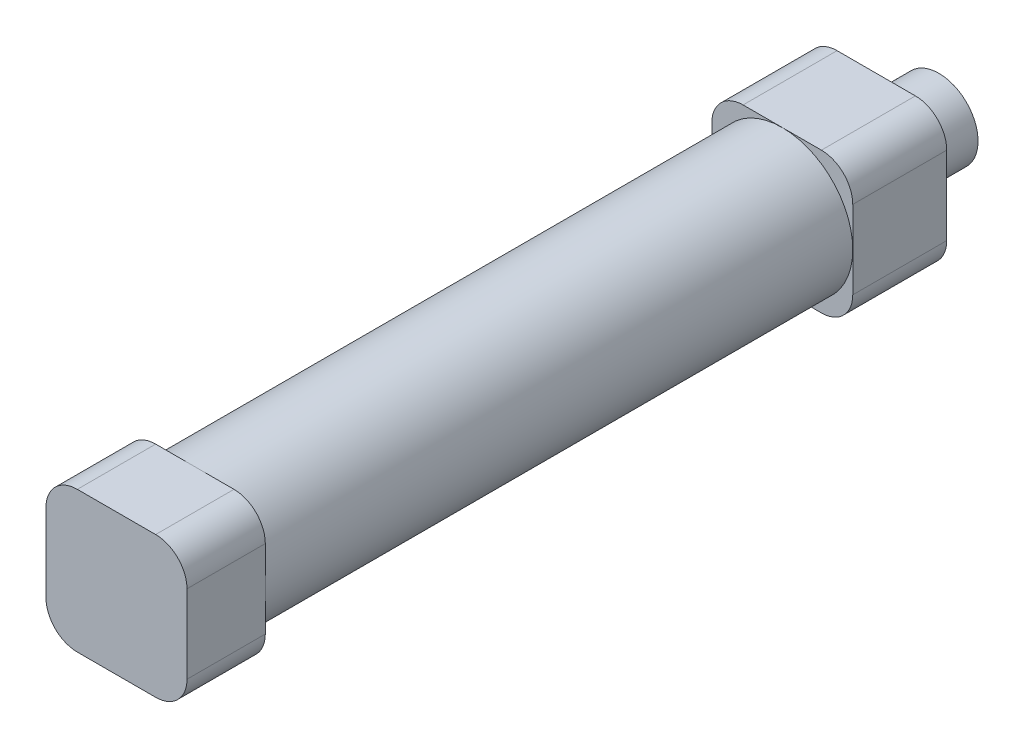
ISO-10303-21;
HEADER;
FILE_DESCRIPTION(('STEP AP214'),'2;1');
FILE_NAME('part.step','',(''),(''),'','','');
FILE_SCHEMA(('AUTOMOTIVE_DESIGN { 1 0 10303 214 1 1 1 1 }'));
ENDSEC;
DATA;
#1=APPLICATION_CONTEXT('core data for automotive mechanical design processes');
#2=APPLICATION_PROTOCOL_DEFINITION('international standard','automotive_design',2000,#1);
#3=PRODUCT_CONTEXT('',#1,'mechanical');
#4=PRODUCT('Part','Part','',(#3));
#5=PRODUCT_RELATED_PRODUCT_CATEGORY('part','',(#4));
#6=PRODUCT_DEFINITION_FORMATION('','',#4);
#7=PRODUCT_DEFINITION_CONTEXT('part definition',#1,'design');
#8=PRODUCT_DEFINITION('design','',#6,#7);
#9=PRODUCT_DEFINITION_SHAPE('','',#8);
#10=(LENGTH_UNIT() NAMED_UNIT(*) SI_UNIT(.MILLI.,.METRE.));
#11=(NAMED_UNIT(*) PLANE_ANGLE_UNIT() SI_UNIT($,.RADIAN.));
#12=(NAMED_UNIT(*) SI_UNIT($,.STERADIAN.) SOLID_ANGLE_UNIT());
#13=UNCERTAINTY_MEASURE_WITH_UNIT(LENGTH_MEASURE(1.E-05),#10,'distance_accuracy_value','');
#14=(GEOMETRIC_REPRESENTATION_CONTEXT(3) GLOBAL_UNCERTAINTY_ASSIGNED_CONTEXT((#13)) GLOBAL_UNIT_ASSIGNED_CONTEXT((#10,
#11,#12)) REPRESENTATION_CONTEXT('',''));
#15=CARTESIAN_POINT('',(0.,0.,0.));
#16=DIRECTION('',(0.,0.,1.));
#17=DIRECTION('',(1.,0.,0.));
#18=AXIS2_PLACEMENT_3D('',#15,#16,#17);
#19=CARTESIAN_POINT('',(4.99999999999999,-5.,0.));
#20=DIRECTION('',(0.,0.,-1.));
#21=DIRECTION('',(-1.,0.,0.));
#22=AXIS2_PLACEMENT_3D('',#19,#20,#21);
#23=PLANE('',#22);
#24=CARTESIAN_POINT('',(0.,0.,0.));
#25=DIRECTION('',(0.,0.,-1.));
#26=DIRECTION('',(-1.,0.,0.));
#27=AXIS2_PLACEMENT_3D('',#24,#25,#26);
#28=CIRCLE('',#27,2.5);
#29=CARTESIAN_POINT('',(-2.5,0.,0.));
#30=VERTEX_POINT('',#29);
#31=EDGE_CURVE('E40',#30,#30,#28,.T.);
#32=ORIENTED_EDGE('',*,*,#31,.T.);
#33=EDGE_LOOP('',(#32));
#34=FACE_BOUND('',#33,.T.);
#35=CARTESIAN_POINT('',(0.,0.,0.));
#36=DIRECTION('',(0.,0.,1.));
#37=DIRECTION('',(1.,0.,0.));
#38=AXIS2_PLACEMENT_3D('',#35,#36,#37);
#39=CIRCLE('',#38,8.);
#40=CARTESIAN_POINT('',(8.,0.,0.));
#41=VERTEX_POINT('',#40);
#42=EDGE_CURVE('E276',#41,#41,#39,.T.);
#43=ORIENTED_EDGE('',*,*,#42,.T.);
#44=EDGE_LOOP('',(#43));
#45=FACE_BOUND('',#44,.T.);
#46=ADVANCED_FACE('F36',(#34,#45),#23,.F.);
#47=CARTESIAN_POINT('',(-5.,5.,75.));
#48=DIRECTION('',(0.,0.,1.));
#49=DIRECTION('',(1.,0.,0.));
#50=AXIS2_PLACEMENT_3D('',#47,#48,#49);
#51=PLANE('',#50);
#52=CARTESIAN_POINT('',(0.,0.,75.));
#53=DIRECTION('',(0.,0.,1.));
#54=DIRECTION('',(1.,0.,0.));
#55=AXIS2_PLACEMENT_3D('',#52,#53,#54);
#56=CIRCLE('',#55,8.);
#57=CARTESIAN_POINT('',(8.,0.,75.));
#58=VERTEX_POINT('',#57);
#59=EDGE_CURVE('E273',#58,#58,#56,.T.);
#60=ORIENTED_EDGE('',*,*,#59,.F.);
#61=EDGE_LOOP('',(#60));
#62=FACE_BOUND('',#61,.T.);
#63=ADVANCED_FACE('F366',(#62),#51,.F.);
#64=CARTESIAN_POINT('',(0.,0.,75.));
#65=DIRECTION('',(0.,0.,-1.));
#66=DIRECTION('',(-1.,0.,0.));
#67=AXIS2_PLACEMENT_3D('',#64,#65,#66);
#68=CYLINDRICAL_SURFACE('',#67,8.);
#69=ORIENTED_EDGE('',*,*,#59,.T.);
#70=EDGE_LOOP('',(#69));
#71=FACE_BOUND('',#70,.T.);
#72=ORIENTED_EDGE('',*,*,#42,.F.);
#73=EDGE_LOOP('',(#72));
#74=FACE_BOUND('',#73,.T.);
#75=ADVANCED_FACE('F373',(#71,#74),#68,.F.);
#76=CARTESIAN_POINT('',(0.,0.,18.));
#77=DIRECTION('',(0.,0.,-1.));
#78=DIRECTION('',(-1.,0.,0.));
#79=AXIS2_PLACEMENT_3D('',#76,#77,#78);
#80=CYLINDRICAL_SURFACE('',#79,2.5);
#81=CARTESIAN_POINT('',(0.,0.,-20.));
#82=DIRECTION('',(0.,0.,-1.));
#83=DIRECTION('',(-1.,0.,0.));
#84=AXIS2_PLACEMENT_3D('',#81,#82,#83);
#85=CIRCLE('',#84,2.5);
#86=CARTESIAN_POINT('',(-2.5,0.,-20.));
#87=VERTEX_POINT('',#86);
#88=EDGE_CURVE('E564',#87,#87,#85,.T.);
#89=ORIENTED_EDGE('',*,*,#88,.T.);
#90=EDGE_LOOP('',(#89));
#91=FACE_BOUND('',#90,.T.);
#92=ORIENTED_EDGE('',*,*,#31,.F.);
#93=EDGE_LOOP('',(#92));
#94=FACE_BOUND('',#93,.T.);
#95=ADVANCED_FACE('F455',(#91,#94),#80,.F.);
#96=CARTESIAN_POINT('',(4.99999999999999,-5.,-12.));
#97=DIRECTION('',(0.,0.,-1.));
#98=DIRECTION('',(-1.,0.,0.));
#99=AXIS2_PLACEMENT_3D('',#96,#97,#98);
#100=PLANE('',#99);
#101=CARTESIAN_POINT('',(4.99999999999999,-5.,-12.));
#102=DIRECTION('',(0.,0.,-1.));
#103=DIRECTION('',(-1.,0.,0.));
#104=AXIS2_PLACEMENT_3D('',#101,#102,#103);
#105=CIRCLE('',#104,4.);
#106=CARTESIAN_POINT('',(8.99999999999999,-5.,-12.));
#107=VERTEX_POINT('',#106);
#108=CARTESIAN_POINT('',(4.99999999999999,-9.,-12.));
#109=VERTEX_POINT('',#108);
#110=EDGE_CURVE('E188',#107,#109,#105,.T.);
#111=ORIENTED_EDGE('',*,*,#110,.T.);
#112=DIRECTION('',(-1.,0.,0.));
#113=VECTOR('',#112,1.);
#114=CARTESIAN_POINT('',(4.99999999999999,-9.,-12.));
#115=LINE('',#114,#113);
#116=CARTESIAN_POINT('',(-5.00000000000001,-9.,-12.));
#117=VERTEX_POINT('',#116);
#118=EDGE_CURVE('E176',#109,#117,#115,.T.);
#119=ORIENTED_EDGE('',*,*,#118,.T.);
#120=CARTESIAN_POINT('',(-5.00000000000001,-5.,-12.));
#121=DIRECTION('',(0.,0.,-1.));
#122=DIRECTION('',(-1.,0.,0.));
#123=AXIS2_PLACEMENT_3D('',#120,#121,#122);
#124=CIRCLE('',#123,4.);
#125=CARTESIAN_POINT('',(-9.00000000000001,-5.,-12.));
#126=VERTEX_POINT('',#125);
#127=EDGE_CURVE('E187',#117,#126,#124,.T.);
#128=ORIENTED_EDGE('',*,*,#127,.T.);
#129=DIRECTION('',(0.,1.,0.));
#130=VECTOR('',#129,1.);
#131=CARTESIAN_POINT('',(-9.00000000000001,-5.,-12.));
#132=LINE('',#131,#130);
#133=CARTESIAN_POINT('',(-9.00000000000001,5.,-12.));
#134=VERTEX_POINT('',#133);
#135=EDGE_CURVE('E342',#126,#134,#132,.T.);
#136=ORIENTED_EDGE('',*,*,#135,.T.);
#137=CARTESIAN_POINT('',(-5.00000000000001,5.,-12.));
#138=DIRECTION('',(0.,0.,-1.));
#139=DIRECTION('',(-1.,0.,0.));
#140=AXIS2_PLACEMENT_3D('',#137,#138,#139);
#141=CIRCLE('',#140,4.);
#142=CARTESIAN_POINT('',(-5.00000000000001,9.,-12.));
#143=VERTEX_POINT('',#142);
#144=EDGE_CURVE('E341',#134,#143,#141,.T.);
#145=ORIENTED_EDGE('',*,*,#144,.T.);
#146=DIRECTION('',(1.,0.,0.));
#147=VECTOR('',#146,1.);
#148=CARTESIAN_POINT('',(4.99999999999999,9.,-12.));
#149=LINE('',#148,#147);
#150=CARTESIAN_POINT('',(4.99999999999999,9.,-12.));
#151=VERTEX_POINT('',#150);
#152=EDGE_CURVE('E344',#143,#151,#149,.T.);
#153=ORIENTED_EDGE('',*,*,#152,.T.);
#154=CARTESIAN_POINT('',(4.99999999999999,5.,-12.));
#155=DIRECTION('',(0.,0.,-1.));
#156=DIRECTION('',(-1.,0.,0.));
#157=AXIS2_PLACEMENT_3D('',#154,#155,#156);
#158=CIRCLE('',#157,4.);
#159=CARTESIAN_POINT('',(8.99999999999999,5.,-12.));
#160=VERTEX_POINT('',#159);
#161=EDGE_CURVE('E349',#151,#160,#158,.T.);
#162=ORIENTED_EDGE('',*,*,#161,.T.);
#163=DIRECTION('',(0.,-1.,0.));
#164=VECTOR('',#163,1.);
#165=CARTESIAN_POINT('',(8.99999999999999,-5.,-12.));
#166=LINE('',#165,#164);
#167=EDGE_CURVE('E194',#160,#107,#166,.T.);
#168=ORIENTED_EDGE('',*,*,#167,.T.);
#169=EDGE_LOOP('',(#111,#119,#128,#136,#145,#153,#162,#168));
#170=FACE_BOUND('',#169,.T.);
#171=CARTESIAN_POINT('',(0.,0.,-12.));
#172=DIRECTION('',(0.,0.,-1.));
#173=DIRECTION('',(-1.,0.,0.));
#174=AXIS2_PLACEMENT_3D('',#171,#172,#173);
#175=CIRCLE('',#174,5.);
#176=CARTESIAN_POINT('',(-5.,0.,-12.));
#177=VERTEX_POINT('',#176);
#178=EDGE_CURVE('E570',#177,#177,#175,.T.);
#179=ORIENTED_EDGE('',*,*,#178,.F.);
#180=EDGE_LOOP('',(#179));
#181=FACE_BOUND('',#180,.T.);
#182=ADVANCED_FACE('F191',(#170,#181),#100,.T.);
#183=CARTESIAN_POINT('',(0.,0.,75.));
#184=DIRECTION('',(0.,0.,-1.));
#185=DIRECTION('',(-1.,0.,0.));
#186=AXIS2_PLACEMENT_3D('',#183,#184,#185);
#187=CYLINDRICAL_SURFACE('',#186,9.);
#188=CARTESIAN_POINT('',(0.,0.,75.));
#189=DIRECTION('',(0.,0.,1.));
#190=DIRECTION('',(1.,0.,0.));
#191=AXIS2_PLACEMENT_3D('',#188,#189,#190);
#192=CIRCLE('',#191,9.);
#193=CARTESIAN_POINT('',(9.,0.,75.));
#194=VERTEX_POINT('',#193);
#195=CARTESIAN_POINT('',(0.,9.,75.));
#196=VERTEX_POINT('',#195);
#197=EDGE_CURVE('E12',#194,#196,#192,.T.);
#198=ORIENTED_EDGE('',*,*,#197,.F.);
#199=CARTESIAN_POINT('',(0.,-9.,75.));
#200=VERTEX_POINT('',#199);
#201=EDGE_CURVE('E47',#200,#194,#192,.T.);
#202=ORIENTED_EDGE('',*,*,#201,.F.);
#203=CARTESIAN_POINT('',(-9.,0.,75.));
#204=VERTEX_POINT('',#203);
#205=EDGE_CURVE('E286',#204,#200,#192,.T.);
#206=ORIENTED_EDGE('',*,*,#205,.F.);
#207=EDGE_CURVE('E45',#196,#204,#192,.T.);
#208=ORIENTED_EDGE('',*,*,#207,.F.);
#209=EDGE_LOOP('',(#198,#202,#206,#208));
#210=FACE_BOUND('',#209,.T.);
#211=CARTESIAN_POINT('',(0.,0.,0.));
#212=DIRECTION('',(0.,0.,1.));
#213=DIRECTION('',(1.,0.,0.));
#214=AXIS2_PLACEMENT_3D('',#211,#212,#213);
#215=CIRCLE('',#214,9.);
#216=CARTESIAN_POINT('',(8.99999999999999,0.,0.));
#217=VERTEX_POINT('',#216);
#218=CARTESIAN_POINT('',(0.,9.,0.));
#219=VERTEX_POINT('',#218);
#220=EDGE_CURVE('E279',#217,#219,#215,.T.);
#221=ORIENTED_EDGE('',*,*,#220,.T.);
#222=CARTESIAN_POINT('',(-9.00000000000001,0.,0.));
#223=VERTEX_POINT('',#222);
#224=EDGE_CURVE('E281',#219,#223,#215,.T.);
#225=ORIENTED_EDGE('',*,*,#224,.T.);
#226=CARTESIAN_POINT('',(0.,-9.,0.));
#227=VERTEX_POINT('',#226);
#228=EDGE_CURVE('E287',#223,#227,#215,.T.);
#229=ORIENTED_EDGE('',*,*,#228,.T.);
#230=EDGE_CURVE('E278',#227,#217,#215,.T.);
#231=ORIENTED_EDGE('',*,*,#230,.T.);
#232=EDGE_LOOP('',(#221,#225,#229,#231));
#233=FACE_BOUND('',#232,.T.);
#234=ADVANCED_FACE('F38',(#210,#233),#187,.T.);
#235=DIRECTION('',(0.,1.,0.));
#236=VECTOR('',#235,1.);
#237=CARTESIAN_POINT('',(9.,-5.,75.));
#238=LINE('',#237,#236);
#239=CARTESIAN_POINT('',(9.,5.,75.));
#240=VERTEX_POINT('',#239);
#241=EDGE_CURVE('E241',#194,#240,#238,.T.);
#242=ORIENTED_EDGE('',*,*,#241,.F.);
#243=ORIENTED_EDGE('',*,*,#197,.T.);
#244=DIRECTION('',(-1.,0.,0.));
#245=VECTOR('',#244,1.);
#246=CARTESIAN_POINT('',(-5.,9.,75.));
#247=LINE('',#246,#245);
#248=CARTESIAN_POINT('',(5.,9.,75.));
#249=VERTEX_POINT('',#248);
#250=EDGE_CURVE('E215',#249,#196,#247,.T.);
#251=ORIENTED_EDGE('',*,*,#250,.F.);
#252=CARTESIAN_POINT('',(5.,5.,75.));
#253=DIRECTION('',(0.,0.,1.));
#254=DIRECTION('',(1.,0.,0.));
#255=AXIS2_PLACEMENT_3D('',#252,#253,#254);
#256=CIRCLE('',#255,4.);
#257=EDGE_CURVE('E245',#240,#249,#256,.T.);
#258=ORIENTED_EDGE('',*,*,#257,.F.);
#259=EDGE_LOOP('',(#242,#243,#251,#258));
#260=FACE_BOUND('',#259,.T.);
#261=ADVANCED_FACE('F376',(#260),#51,.F.);
#262=CARTESIAN_POINT('',(-5.,9.,75.));
#263=VERTEX_POINT('',#262);
#264=EDGE_CURVE('E247',#196,#263,#247,.T.);
#265=ORIENTED_EDGE('',*,*,#264,.F.);
#266=ORIENTED_EDGE('',*,*,#207,.T.);
#267=DIRECTION('',(0.,-1.,0.));
#268=VECTOR('',#267,1.);
#269=CARTESIAN_POINT('',(-9.,-5.,75.));
#270=LINE('',#269,#268);
#271=CARTESIAN_POINT('',(-9.,5.,75.));
#272=VERTEX_POINT('',#271);
#273=EDGE_CURVE('E230',#272,#204,#270,.T.);
#274=ORIENTED_EDGE('',*,*,#273,.F.);
#275=CARTESIAN_POINT('',(-5.,5.,75.));
#276=DIRECTION('',(0.,0.,1.));
#277=DIRECTION('',(1.,0.,0.));
#278=AXIS2_PLACEMENT_3D('',#275,#276,#277);
#279=CIRCLE('',#278,4.);
#280=EDGE_CURVE('E202',#263,#272,#279,.T.);
#281=ORIENTED_EDGE('',*,*,#280,.F.);
#282=EDGE_LOOP('',(#265,#266,#274,#281));
#283=FACE_BOUND('',#282,.T.);
#284=ADVANCED_FACE('F592',(#283),#51,.F.);
#285=CARTESIAN_POINT('',(-9.,-5.,75.));
#286=VERTEX_POINT('',#285);
#287=EDGE_CURVE('E205',#204,#286,#270,.T.);
#288=ORIENTED_EDGE('',*,*,#287,.F.);
#289=ORIENTED_EDGE('',*,*,#205,.T.);
#290=DIRECTION('',(1.,0.,0.));
#291=VECTOR('',#290,1.);
#292=CARTESIAN_POINT('',(-5.,-9.,75.));
#293=LINE('',#292,#291);
#294=CARTESIAN_POINT('',(-5.,-9.,75.));
#295=VERTEX_POINT('',#294);
#296=EDGE_CURVE('E236',#295,#200,#293,.T.);
#297=ORIENTED_EDGE('',*,*,#296,.F.);
#298=CARTESIAN_POINT('',(-5.,-5.,75.));
#299=DIRECTION('',(0.,0.,1.));
#300=DIRECTION('',(1.,0.,0.));
#301=AXIS2_PLACEMENT_3D('',#298,#299,#300);
#302=CIRCLE('',#301,4.);
#303=EDGE_CURVE('E233',#286,#295,#302,.T.);
#304=ORIENTED_EDGE('',*,*,#303,.F.);
#305=EDGE_LOOP('',(#288,#289,#297,#304));
#306=FACE_BOUND('',#305,.T.);
#307=ADVANCED_FACE('F595',(#306),#51,.F.);
#308=CARTESIAN_POINT('',(5.,-9.,75.));
#309=VERTEX_POINT('',#308);
#310=EDGE_CURVE('E235',#200,#309,#293,.T.);
#311=ORIENTED_EDGE('',*,*,#310,.F.);
#312=ORIENTED_EDGE('',*,*,#201,.T.);
#313=CARTESIAN_POINT('',(9.,-5.,75.));
#314=VERTEX_POINT('',#313);
#315=EDGE_CURVE('E242',#314,#194,#238,.T.);
#316=ORIENTED_EDGE('',*,*,#315,.F.);
#317=CARTESIAN_POINT('',(5.,-5.,75.));
#318=DIRECTION('',(0.,0.,1.));
#319=DIRECTION('',(-1.,0.,0.));
#320=AXIS2_PLACEMENT_3D('',#317,#318,#319);
#321=CIRCLE('',#320,4.);
#322=EDGE_CURVE('E239',#309,#314,#321,.T.);
#323=ORIENTED_EDGE('',*,*,#322,.F.);
#324=EDGE_LOOP('',(#311,#312,#316,#323));
#325=FACE_BOUND('',#324,.T.);
#326=ADVANCED_FACE('F377',(#325),#51,.F.);
#327=CARTESIAN_POINT('',(-5.,5.,85.));
#328=DIRECTION('',(0.,0.,-1.));
#329=DIRECTION('',(-1.,0.,0.));
#330=AXIS2_PLACEMENT_3D('',#327,#328,#329);
#331=CYLINDRICAL_SURFACE('',#330,4.);
#332=ORIENTED_EDGE('',*,*,#280,.T.);
#333=DIRECTION('',(0.,0.,-1.));
#334=VECTOR('',#333,1.);
#335=CARTESIAN_POINT('',(-9.,5.,85.));
#336=LINE('',#335,#334);
#337=CARTESIAN_POINT('',(-9.,5.,85.));
#338=VERTEX_POINT('',#337);
#339=EDGE_CURVE('E270',#338,#272,#336,.T.);
#340=ORIENTED_EDGE('',*,*,#339,.F.);
#341=CARTESIAN_POINT('',(-5.,5.,85.));
#342=DIRECTION('',(0.,0.,1.));
#343=DIRECTION('',(1.,0.,0.));
#344=AXIS2_PLACEMENT_3D('',#341,#342,#343);
#345=CIRCLE('',#344,4.);
#346=CARTESIAN_POINT('',(-5.,9.,85.));
#347=VERTEX_POINT('',#346);
#348=EDGE_CURVE('E211',#347,#338,#345,.T.);
#349=ORIENTED_EDGE('',*,*,#348,.F.);
#350=DIRECTION('',(0.,0.,-1.));
#351=VECTOR('',#350,1.);
#352=CARTESIAN_POINT('',(-5.,9.,85.));
#353=LINE('',#352,#351);
#354=EDGE_CURVE('E228',#347,#263,#353,.T.);
#355=ORIENTED_EDGE('',*,*,#354,.T.);
#356=EDGE_LOOP('',(#332,#340,#349,#355));
#357=FACE_BOUND('',#356,.T.);
#358=ADVANCED_FACE('F499',(#357),#331,.T.);
#359=CARTESIAN_POINT('',(-9.,-5.,85.));
#360=DIRECTION('',(1.,0.,0.));
#361=DIRECTION('',(0.,0.,-1.));
#362=AXIS2_PLACEMENT_3D('',#359,#360,#361);
#363=PLANE('',#362);
#364=CARTESIAN_POINT('',(-9.00000000000001,0.,79.));
#365=DIRECTION('',(-1.,0.,0.));
#366=DIRECTION('',(0.,0.,1.));
#367=AXIS2_PLACEMENT_3D('',#364,#365,#366);
#368=CIRCLE('',#367,1.98051649837292);
#369=CARTESIAN_POINT('',(-9.00000000000001,0.,80.9805164983729));
#370=VERTEX_POINT('',#369);
#371=EDGE_CURVE('E555',#370,#370,#368,.T.);
#372=ORIENTED_EDGE('',*,*,#371,.F.);
#373=EDGE_LOOP('',(#372));
#374=FACE_BOUND('',#373,.T.);
#375=ORIENTED_EDGE('',*,*,#273,.T.);
#376=ORIENTED_EDGE('',*,*,#287,.T.);
#377=DIRECTION('',(0.,0.,-1.));
#378=VECTOR('',#377,1.);
#379=CARTESIAN_POINT('',(-9.,-5.,85.));
#380=LINE('',#379,#378);
#381=CARTESIAN_POINT('',(-9.,-5.,85.));
#382=VERTEX_POINT('',#381);
#383=EDGE_CURVE('E267',#382,#286,#380,.T.);
#384=ORIENTED_EDGE('',*,*,#383,.F.);
#385=DIRECTION('',(0.,-1.,0.));
#386=VECTOR('',#385,1.);
#387=CARTESIAN_POINT('',(-9.,-5.,85.));
#388=LINE('',#387,#386);
#389=EDGE_CURVE('E214',#338,#382,#388,.T.);
#390=ORIENTED_EDGE('',*,*,#389,.F.);
#391=ORIENTED_EDGE('',*,*,#339,.T.);
#392=EDGE_LOOP('',(#375,#376,#384,#390,#391));
#393=FACE_BOUND('',#392,.T.);
#394=ADVANCED_FACE('F494',(#374,#393),#363,.F.);
#395=CARTESIAN_POINT('',(-5.,-5.,85.));
#396=DIRECTION('',(0.,0.,-1.));
#397=DIRECTION('',(-1.,0.,0.));
#398=AXIS2_PLACEMENT_3D('',#395,#396,#397);
#399=CYLINDRICAL_SURFACE('',#398,4.);
#400=ORIENTED_EDGE('',*,*,#303,.T.);
#401=DIRECTION('',(0.,0.,-1.));
#402=VECTOR('',#401,1.);
#403=CARTESIAN_POINT('',(-5.,-9.,85.));
#404=LINE('',#403,#402);
#405=CARTESIAN_POINT('',(-5.,-9.,85.));
#406=VERTEX_POINT('',#405);
#407=EDGE_CURVE('E264',#406,#295,#404,.T.);
#408=ORIENTED_EDGE('',*,*,#407,.F.);
#409=CARTESIAN_POINT('',(-5.,-5.,85.));
#410=DIRECTION('',(0.,0.,1.));
#411=DIRECTION('',(1.,0.,0.));
#412=AXIS2_PLACEMENT_3D('',#409,#410,#411);
#413=CIRCLE('',#412,4.);
#414=EDGE_CURVE('E217',#382,#406,#413,.T.);
#415=ORIENTED_EDGE('',*,*,#414,.F.);
#416=ORIENTED_EDGE('',*,*,#383,.T.);
#417=EDGE_LOOP('',(#400,#408,#415,#416));
#418=FACE_BOUND('',#417,.T.);
#419=ADVANCED_FACE('F498',(#418),#399,.T.);
#420=CARTESIAN_POINT('',(-5.,-9.,85.));
#421=DIRECTION('',(0.,1.,0.));
#422=DIRECTION('',(0.,0.,1.));
#423=AXIS2_PLACEMENT_3D('',#420,#421,#422);
#424=PLANE('',#423);
#425=ORIENTED_EDGE('',*,*,#296,.T.);
#426=ORIENTED_EDGE('',*,*,#310,.T.);
#427=DIRECTION('',(0.,0.,-1.));
#428=VECTOR('',#427,1.);
#429=CARTESIAN_POINT('',(5.,-9.,85.));
#430=LINE('',#429,#428);
#431=CARTESIAN_POINT('',(5.,-9.,85.));
#432=VERTEX_POINT('',#431);
#433=EDGE_CURVE('E261',#432,#309,#430,.T.);
#434=ORIENTED_EDGE('',*,*,#433,.F.);
#435=DIRECTION('',(1.,0.,0.));
#436=VECTOR('',#435,1.);
#437=CARTESIAN_POINT('',(-5.,-9.,85.));
#438=LINE('',#437,#436);
#439=EDGE_CURVE('E219',#406,#432,#438,.T.);
#440=ORIENTED_EDGE('',*,*,#439,.F.);
#441=ORIENTED_EDGE('',*,*,#407,.T.);
#442=EDGE_LOOP('',(#425,#426,#434,#440,#441));
#443=FACE_BOUND('',#442,.T.);
#444=ADVANCED_FACE('F603',(#443),#424,.F.);
#445=CARTESIAN_POINT('',(5.,-5.,85.));
#446=DIRECTION('',(0.,0.,-1.));
#447=DIRECTION('',(-1.,0.,0.));
#448=AXIS2_PLACEMENT_3D('',#445,#446,#447);
#449=CYLINDRICAL_SURFACE('',#448,4.);
#450=ORIENTED_EDGE('',*,*,#322,.T.);
#451=DIRECTION('',(0.,0.,-1.));
#452=VECTOR('',#451,1.);
#453=CARTESIAN_POINT('',(9.,-5.,85.));
#454=LINE('',#453,#452);
#455=CARTESIAN_POINT('',(9.,-5.,85.));
#456=VERTEX_POINT('',#455);
#457=EDGE_CURVE('E258',#456,#314,#454,.T.);
#458=ORIENTED_EDGE('',*,*,#457,.F.);
#459=CARTESIAN_POINT('',(5.,-5.,85.));
#460=DIRECTION('',(0.,0.,1.));
#461=DIRECTION('',(-1.,0.,0.));
#462=AXIS2_PLACEMENT_3D('',#459,#460,#461);
#463=CIRCLE('',#462,4.);
#464=EDGE_CURVE('E221',#432,#456,#463,.T.);
#465=ORIENTED_EDGE('',*,*,#464,.F.);
#466=ORIENTED_EDGE('',*,*,#433,.T.);
#467=EDGE_LOOP('',(#450,#458,#465,#466));
#468=FACE_BOUND('',#467,.T.);
#469=ADVANCED_FACE('F621',(#468),#449,.T.);
#470=CARTESIAN_POINT('',(9.,-5.,85.));
#471=DIRECTION('',(-1.,0.,0.));
#472=DIRECTION('',(0.,-1.,0.));
#473=AXIS2_PLACEMENT_3D('',#470,#471,#472);
#474=PLANE('',#473);
#475=ORIENTED_EDGE('',*,*,#315,.T.);
#476=ORIENTED_EDGE('',*,*,#241,.T.);
#477=DIRECTION('',(0.,0.,-1.));
#478=VECTOR('',#477,1.);
#479=CARTESIAN_POINT('',(9.,5.,85.));
#480=LINE('',#479,#478);
#481=CARTESIAN_POINT('',(9.,5.,85.));
#482=VERTEX_POINT('',#481);
#483=EDGE_CURVE('E255',#482,#240,#480,.T.);
#484=ORIENTED_EDGE('',*,*,#483,.F.);
#485=DIRECTION('',(0.,1.,0.));
#486=VECTOR('',#485,1.);
#487=CARTESIAN_POINT('',(9.,-5.,85.));
#488=LINE('',#487,#486);
#489=EDGE_CURVE('E223',#456,#482,#488,.T.);
#490=ORIENTED_EDGE('',*,*,#489,.F.);
#491=ORIENTED_EDGE('',*,*,#457,.T.);
#492=EDGE_LOOP('',(#475,#476,#484,#490,#491));
#493=FACE_BOUND('',#492,.T.);
#494=ADVANCED_FACE('F625',(#493),#474,.F.);
#495=CARTESIAN_POINT('',(5.,5.,85.));
#496=DIRECTION('',(0.,0.,-1.));
#497=DIRECTION('',(-1.,0.,0.));
#498=AXIS2_PLACEMENT_3D('',#495,#496,#497);
#499=CYLINDRICAL_SURFACE('',#498,4.);
#500=ORIENTED_EDGE('',*,*,#257,.T.);
#501=DIRECTION('',(0.,0.,-1.));
#502=VECTOR('',#501,1.);
#503=CARTESIAN_POINT('',(5.,9.,85.));
#504=LINE('',#503,#502);
#505=CARTESIAN_POINT('',(5.,9.,85.));
#506=VERTEX_POINT('',#505);
#507=EDGE_CURVE('E252',#506,#249,#504,.T.);
#508=ORIENTED_EDGE('',*,*,#507,.F.);
#509=CARTESIAN_POINT('',(5.,5.,85.));
#510=DIRECTION('',(0.,0.,1.));
#511=DIRECTION('',(1.,0.,0.));
#512=AXIS2_PLACEMENT_3D('',#509,#510,#511);
#513=CIRCLE('',#512,4.);
#514=EDGE_CURVE('E225',#482,#506,#513,.T.);
#515=ORIENTED_EDGE('',*,*,#514,.F.);
#516=ORIENTED_EDGE('',*,*,#483,.T.);
#517=EDGE_LOOP('',(#500,#508,#515,#516));
#518=FACE_BOUND('',#517,.T.);
#519=ADVANCED_FACE('F628',(#518),#499,.T.);
#520=CARTESIAN_POINT('',(-5.,9.,85.));
#521=DIRECTION('',(0.,-1.,0.));
#522=DIRECTION('',(0.,0.,-1.));
#523=AXIS2_PLACEMENT_3D('',#520,#521,#522);
#524=PLANE('',#523);
#525=ORIENTED_EDGE('',*,*,#250,.T.);
#526=ORIENTED_EDGE('',*,*,#264,.T.);
#527=ORIENTED_EDGE('',*,*,#354,.F.);
#528=DIRECTION('',(-1.,0.,0.));
#529=VECTOR('',#528,1.);
#530=CARTESIAN_POINT('',(-5.,9.,85.));
#531=LINE('',#530,#529);
#532=EDGE_CURVE('E227',#506,#347,#531,.T.);
#533=ORIENTED_EDGE('',*,*,#532,.F.);
#534=ORIENTED_EDGE('',*,*,#507,.T.);
#535=EDGE_LOOP('',(#525,#526,#527,#533,#534));
#536=FACE_BOUND('',#535,.T.);
#537=ADVANCED_FACE('F401',(#536),#524,.F.);
#538=CARTESIAN_POINT('',(-5.,5.,85.));
#539=DIRECTION('',(0.,0.,1.));
#540=DIRECTION('',(1.,0.,0.));
#541=AXIS2_PLACEMENT_3D('',#538,#539,#540);
#542=PLANE('',#541);
#543=ORIENTED_EDGE('',*,*,#348,.T.);
#544=ORIENTED_EDGE('',*,*,#389,.T.);
#545=ORIENTED_EDGE('',*,*,#414,.T.);
#546=ORIENTED_EDGE('',*,*,#439,.T.);
#547=ORIENTED_EDGE('',*,*,#464,.T.);
#548=ORIENTED_EDGE('',*,*,#489,.T.);
#549=ORIENTED_EDGE('',*,*,#514,.T.);
#550=ORIENTED_EDGE('',*,*,#532,.T.);
#551=EDGE_LOOP('',(#543,#544,#545,#546,#547,#548,#549,#550));
#552=FACE_BOUND('',#551,.T.);
#553=ADVANCED_FACE('F396',(#552),#542,.T.);
#554=ORIENTED_EDGE('',*,*,#220,.F.);
#555=DIRECTION('',(0.,-1.,0.));
#556=VECTOR('',#555,1.);
#557=CARTESIAN_POINT('',(8.99999999999999,-5.,0.));
#558=LINE('',#557,#556);
#559=CARTESIAN_POINT('',(8.99999999999999,5.,0.));
#560=VERTEX_POINT('',#559);
#561=EDGE_CURVE('E54',#560,#217,#558,.T.);
#562=ORIENTED_EDGE('',*,*,#561,.F.);
#563=CARTESIAN_POINT('',(4.99999999999999,5.,0.));
#564=DIRECTION('',(0.,0.,-1.));
#565=DIRECTION('',(-1.,0.,0.));
#566=AXIS2_PLACEMENT_3D('',#563,#564,#565);
#567=CIRCLE('',#566,4.);
#568=CARTESIAN_POINT('',(4.99999999999999,9.,0.));
#569=VERTEX_POINT('',#568);
#570=EDGE_CURVE('E322',#569,#560,#567,.T.);
#571=ORIENTED_EDGE('',*,*,#570,.F.);
#572=DIRECTION('',(1.,0.,0.));
#573=VECTOR('',#572,1.);
#574=CARTESIAN_POINT('',(4.99999999999999,9.,0.));
#575=LINE('',#574,#573);
#576=EDGE_CURVE('E314',#219,#569,#575,.T.);
#577=ORIENTED_EDGE('',*,*,#576,.F.);
#578=EDGE_LOOP('',(#554,#562,#571,#577));
#579=FACE_BOUND('',#578,.T.);
#580=ADVANCED_FACE('F386',(#579),#23,.F.);
#581=ORIENTED_EDGE('',*,*,#224,.F.);
#582=CARTESIAN_POINT('',(-5.00000000000001,9.,0.));
#583=VERTEX_POINT('',#582);
#584=EDGE_CURVE('E319',#583,#219,#575,.T.);
#585=ORIENTED_EDGE('',*,*,#584,.F.);
#586=CARTESIAN_POINT('',(-5.00000000000001,5.,0.));
#587=DIRECTION('',(0.,0.,-1.));
#588=DIRECTION('',(-1.,0.,0.));
#589=AXIS2_PLACEMENT_3D('',#586,#587,#588);
#590=CIRCLE('',#589,4.);
#591=CARTESIAN_POINT('',(-9.00000000000001,5.,0.));
#592=VERTEX_POINT('',#591);
#593=EDGE_CURVE('E304',#592,#583,#590,.T.);
#594=ORIENTED_EDGE('',*,*,#593,.F.);
#595=DIRECTION('',(0.,1.,0.));
#596=VECTOR('',#595,1.);
#597=CARTESIAN_POINT('',(-9.00000000000001,-5.,0.));
#598=LINE('',#597,#596);
#599=EDGE_CURVE('E300',#223,#592,#598,.T.);
#600=ORIENTED_EDGE('',*,*,#599,.F.);
#601=EDGE_LOOP('',(#581,#585,#594,#600));
#602=FACE_BOUND('',#601,.T.);
#603=ADVANCED_FACE('F301',(#602),#23,.F.);
#604=ORIENTED_EDGE('',*,*,#228,.F.);
#605=CARTESIAN_POINT('',(-9.00000000000001,-5.,0.));
#606=VERTEX_POINT('',#605);
#607=EDGE_CURVE('E296',#606,#223,#598,.T.);
#608=ORIENTED_EDGE('',*,*,#607,.F.);
#609=CARTESIAN_POINT('',(-5.00000000000001,-5.,0.));
#610=DIRECTION('',(0.,0.,-1.));
#611=DIRECTION('',(-1.,0.,0.));
#612=AXIS2_PLACEMENT_3D('',#609,#610,#611);
#613=CIRCLE('',#612,4.);
#614=CARTESIAN_POINT('',(-5.00000000000001,-9.,0.));
#615=VERTEX_POINT('',#614);
#616=EDGE_CURVE('E308',#615,#606,#613,.T.);
#617=ORIENTED_EDGE('',*,*,#616,.F.);
#618=DIRECTION('',(-1.,0.,0.));
#619=VECTOR('',#618,1.);
#620=CARTESIAN_POINT('',(4.99999999999999,-9.,0.));
#621=LINE('',#620,#619);
#622=EDGE_CURVE('E297',#227,#615,#621,.T.);
#623=ORIENTED_EDGE('',*,*,#622,.F.);
#624=EDGE_LOOP('',(#604,#608,#617,#623));
#625=FACE_BOUND('',#624,.T.);
#626=ADVANCED_FACE('F293',(#625),#23,.F.);
#627=CARTESIAN_POINT('',(4.99999999999999,-5.,-12.));
#628=DIRECTION('',(0.,0.,1.));
#629=DIRECTION('',(1.,0.,0.));
#630=AXIS2_PLACEMENT_3D('',#627,#628,#629);
#631=CYLINDRICAL_SURFACE('',#630,4.);
#632=CARTESIAN_POINT('',(4.99999999999999,-5.,0.));
#633=DIRECTION('',(0.,0.,-1.));
#634=DIRECTION('',(-1.,0.,0.));
#635=AXIS2_PLACEMENT_3D('',#632,#633,#634);
#636=CIRCLE('',#635,4.);
#637=CARTESIAN_POINT('',(8.99999999999999,-5.,0.));
#638=VERTEX_POINT('',#637);
#639=CARTESIAN_POINT('',(4.99999999999999,-9.,0.));
#640=VERTEX_POINT('',#639);
#641=EDGE_CURVE('E201',#638,#640,#636,.T.);
#642=ORIENTED_EDGE('',*,*,#641,.T.);
#643=DIRECTION('',(0.,0.,1.));
#644=VECTOR('',#643,1.);
#645=CARTESIAN_POINT('',(4.99999999999999,-9.,-12.));
#646=LINE('',#645,#644);
#647=EDGE_CURVE('E181',#109,#640,#646,.T.);
#648=ORIENTED_EDGE('',*,*,#647,.F.);
#649=ORIENTED_EDGE('',*,*,#110,.F.);
#650=DIRECTION('',(0.,0.,1.));
#651=VECTOR('',#650,1.);
#652=CARTESIAN_POINT('',(8.99999999999999,-5.,-12.));
#653=LINE('',#652,#651);
#654=EDGE_CURVE('E326',#107,#638,#653,.T.);
#655=ORIENTED_EDGE('',*,*,#654,.T.);
#656=EDGE_LOOP('',(#642,#648,#649,#655));
#657=FACE_BOUND('',#656,.T.);
#658=ADVANCED_FACE('F199',(#657),#631,.T.);
#659=CARTESIAN_POINT('',(4.99999999999999,-9.,-12.));
#660=DIRECTION('',(0.,1.,0.));
#661=DIRECTION('',(0.,0.,1.));
#662=AXIS2_PLACEMENT_3D('',#659,#660,#661);
#663=PLANE('',#662);
#664=EDGE_CURVE('E353',#640,#227,#621,.T.);
#665=ORIENTED_EDGE('',*,*,#664,.T.);
#666=ORIENTED_EDGE('',*,*,#622,.T.);
#667=DIRECTION('',(0.,0.,1.));
#668=VECTOR('',#667,1.);
#669=CARTESIAN_POINT('',(-5.00000000000001,-9.,-12.));
#670=LINE('',#669,#668);
#671=EDGE_CURVE('E184',#117,#615,#670,.T.);
#672=ORIENTED_EDGE('',*,*,#671,.F.);
#673=ORIENTED_EDGE('',*,*,#118,.F.);
#674=ORIENTED_EDGE('',*,*,#647,.T.);
#675=EDGE_LOOP('',(#665,#666,#672,#673,#674));
#676=FACE_BOUND('',#675,.T.);
#677=ADVANCED_FACE('F179',(#676),#663,.F.);
#678=CARTESIAN_POINT('',(-5.00000000000001,-5.,-12.));
#679=DIRECTION('',(0.,0.,1.));
#680=DIRECTION('',(1.,0.,0.));
#681=AXIS2_PLACEMENT_3D('',#678,#679,#680);
#682=CYLINDRICAL_SURFACE('',#681,4.);
#683=ORIENTED_EDGE('',*,*,#616,.T.);
#684=DIRECTION('',(0.,0.,1.));
#685=VECTOR('',#684,1.);
#686=CARTESIAN_POINT('',(-9.00000000000001,-5.,-12.));
#687=LINE('',#686,#685);
#688=EDGE_CURVE('E207',#126,#606,#687,.T.);
#689=ORIENTED_EDGE('',*,*,#688,.F.);
#690=ORIENTED_EDGE('',*,*,#127,.F.);
#691=ORIENTED_EDGE('',*,*,#671,.T.);
#692=EDGE_LOOP('',(#683,#689,#690,#691));
#693=FACE_BOUND('',#692,.T.);
#694=ADVANCED_FACE('F355',(#693),#682,.T.);
#695=CARTESIAN_POINT('',(-9.00000000000001,-5.,-12.));
#696=DIRECTION('',(1.,0.,0.));
#697=DIRECTION('',(0.,0.,-1.));
#698=AXIS2_PLACEMENT_3D('',#695,#696,#697);
#699=PLANE('',#698);
#700=CARTESIAN_POINT('',(-9.00000000000001,0.,-4.));
#701=DIRECTION('',(-1.,0.,0.));
#702=DIRECTION('',(0.,0.,1.));
#703=AXIS2_PLACEMENT_3D('',#700,#701,#702);
#704=CIRCLE('',#703,2.);
#705=CARTESIAN_POINT('',(-9.00000000000001,0.,-2.));
#706=VERTEX_POINT('',#705);
#707=EDGE_CURVE('E554',#706,#706,#704,.T.);
#708=ORIENTED_EDGE('',*,*,#707,.F.);
#709=EDGE_LOOP('',(#708));
#710=FACE_BOUND('',#709,.T.);
#711=ORIENTED_EDGE('',*,*,#607,.T.);
#712=ORIENTED_EDGE('',*,*,#599,.T.);
#713=DIRECTION('',(0.,0.,1.));
#714=VECTOR('',#713,1.);
#715=CARTESIAN_POINT('',(-9.00000000000001,5.,-12.));
#716=LINE('',#715,#714);
#717=EDGE_CURVE('E336',#134,#592,#716,.T.);
#718=ORIENTED_EDGE('',*,*,#717,.F.);
#719=ORIENTED_EDGE('',*,*,#135,.F.);
#720=ORIENTED_EDGE('',*,*,#688,.T.);
#721=EDGE_LOOP('',(#711,#712,#718,#719,#720));
#722=FACE_BOUND('',#721,.T.);
#723=ADVANCED_FACE('F311',(#710,#722),#699,.F.);
#724=CARTESIAN_POINT('',(-5.00000000000001,5.,-12.));
#725=DIRECTION('',(0.,0.,1.));
#726=DIRECTION('',(1.,0.,0.));
#727=AXIS2_PLACEMENT_3D('',#724,#725,#726);
#728=CYLINDRICAL_SURFACE('',#727,4.);
#729=ORIENTED_EDGE('',*,*,#593,.T.);
#730=DIRECTION('',(0.,0.,1.));
#731=VECTOR('',#730,1.);
#732=CARTESIAN_POINT('',(-5.00000000000001,9.,-12.));
#733=LINE('',#732,#731);
#734=EDGE_CURVE('E333',#143,#583,#733,.T.);
#735=ORIENTED_EDGE('',*,*,#734,.F.);
#736=ORIENTED_EDGE('',*,*,#144,.F.);
#737=ORIENTED_EDGE('',*,*,#717,.T.);
#738=EDGE_LOOP('',(#729,#735,#736,#737));
#739=FACE_BOUND('',#738,.T.);
#740=ADVANCED_FACE('F339',(#739),#728,.T.);
#741=CARTESIAN_POINT('',(4.99999999999999,9.,-12.));
#742=DIRECTION('',(0.,-1.,0.));
#743=DIRECTION('',(0.,0.,-1.));
#744=AXIS2_PLACEMENT_3D('',#741,#742,#743);
#745=PLANE('',#744);
#746=ORIENTED_EDGE('',*,*,#584,.T.);
#747=ORIENTED_EDGE('',*,*,#576,.T.);
#748=DIRECTION('',(0.,0.,1.));
#749=VECTOR('',#748,1.);
#750=CARTESIAN_POINT('',(4.99999999999999,9.,-12.));
#751=LINE('',#750,#749);
#752=EDGE_CURVE('E330',#151,#569,#751,.T.);
#753=ORIENTED_EDGE('',*,*,#752,.F.);
#754=ORIENTED_EDGE('',*,*,#152,.F.);
#755=ORIENTED_EDGE('',*,*,#734,.T.);
#756=EDGE_LOOP('',(#746,#747,#753,#754,#755));
#757=FACE_BOUND('',#756,.T.);
#758=ADVANCED_FACE('F407',(#757),#745,.F.);
#759=CARTESIAN_POINT('',(4.99999999999999,5.,-12.));
#760=DIRECTION('',(0.,0.,1.));
#761=DIRECTION('',(1.,0.,0.));
#762=AXIS2_PLACEMENT_3D('',#759,#760,#761);
#763=CYLINDRICAL_SURFACE('',#762,4.);
#764=ORIENTED_EDGE('',*,*,#570,.T.);
#765=DIRECTION('',(0.,0.,1.));
#766=VECTOR('',#765,1.);
#767=CARTESIAN_POINT('',(8.99999999999999,5.,-12.));
#768=LINE('',#767,#766);
#769=EDGE_CURVE('E328',#160,#560,#768,.T.);
#770=ORIENTED_EDGE('',*,*,#769,.F.);
#771=ORIENTED_EDGE('',*,*,#161,.F.);
#772=ORIENTED_EDGE('',*,*,#752,.T.);
#773=EDGE_LOOP('',(#764,#770,#771,#772));
#774=FACE_BOUND('',#773,.T.);
#775=ADVANCED_FACE('F412',(#774),#763,.T.);
#776=CARTESIAN_POINT('',(8.99999999999999,-5.,-12.));
#777=DIRECTION('',(-1.,0.,0.));
#778=DIRECTION('',(0.,0.,1.));
#779=AXIS2_PLACEMENT_3D('',#776,#777,#778);
#780=PLANE('',#779);
#781=ORIENTED_EDGE('',*,*,#561,.T.);
#782=EDGE_CURVE('E324',#217,#638,#558,.T.);
#783=ORIENTED_EDGE('',*,*,#782,.T.);
#784=ORIENTED_EDGE('',*,*,#654,.F.);
#785=ORIENTED_EDGE('',*,*,#167,.F.);
#786=ORIENTED_EDGE('',*,*,#769,.T.);
#787=EDGE_LOOP('',(#781,#783,#784,#785,#786));
#788=FACE_BOUND('',#787,.T.);
#789=ADVANCED_FACE('F384',(#788),#780,.F.);
#790=ORIENTED_EDGE('',*,*,#230,.F.);
#791=ORIENTED_EDGE('',*,*,#664,.F.);
#792=ORIENTED_EDGE('',*,*,#641,.F.);
#793=ORIENTED_EDGE('',*,*,#782,.F.);
#794=EDGE_LOOP('',(#790,#791,#792,#793));
#795=FACE_BOUND('',#794,.T.);
#796=ADVANCED_FACE('F369',(#795),#23,.F.);
#797=CARTESIAN_POINT('',(0.,0.,-20.));
#798=DIRECTION('',(0.,0.,1.));
#799=DIRECTION('',(1.,0.,0.));
#800=AXIS2_PLACEMENT_3D('',#797,#798,#799);
#801=CYLINDRICAL_SURFACE('',#800,5.);
#802=CARTESIAN_POINT('',(0.,0.,-20.));
#803=DIRECTION('',(0.,0.,-1.));
#804=DIRECTION('',(-1.,0.,0.));
#805=AXIS2_PLACEMENT_3D('',#802,#803,#804);
#806=CIRCLE('',#805,5.);
#807=CARTESIAN_POINT('',(-5.,0.,-20.));
#808=VERTEX_POINT('',#807);
#809=EDGE_CURVE('E352',#808,#808,#806,.T.);
#810=ORIENTED_EDGE('',*,*,#809,.F.);
#811=EDGE_LOOP('',(#810));
#812=FACE_BOUND('',#811,.T.);
#813=ORIENTED_EDGE('',*,*,#178,.T.);
#814=EDGE_LOOP('',(#813));
#815=FACE_BOUND('',#814,.T.);
#816=ADVANCED_FACE('F383',(#812,#815),#801,.T.);
#817=CARTESIAN_POINT('',(0.,0.,-20.));
#818=DIRECTION('',(0.,0.,-1.));
#819=DIRECTION('',(-1.,0.,0.));
#820=AXIS2_PLACEMENT_3D('',#817,#818,#819);
#821=PLANE('',#820);
#822=ORIENTED_EDGE('',*,*,#88,.F.);
#823=EDGE_LOOP('',(#822));
#824=FACE_BOUND('',#823,.T.);
#825=ORIENTED_EDGE('',*,*,#809,.T.);
#826=EDGE_LOOP('',(#825));
#827=FACE_BOUND('',#826,.T.);
#828=ADVANCED_FACE('F463',(#824,#827),#821,.T.);
#829=CARTESIAN_POINT('',(-6.00000000000001,0.,-4.));
#830=DIRECTION('',(-1.,0.,0.));
#831=DIRECTION('',(0.,0.,1.));
#832=AXIS2_PLACEMENT_3D('',#829,#830,#831);
#833=CYLINDRICAL_SURFACE('',#832,2.);
#834=CARTESIAN_POINT('',(-6.00000000000001,0.,-4.));
#835=DIRECTION('',(-1.,0.,0.));
#836=DIRECTION('',(0.,0.,1.));
#837=AXIS2_PLACEMENT_3D('',#834,#835,#836);
#838=CIRCLE('',#837,2.);
#839=CARTESIAN_POINT('',(-6.00000000000001,0.,-2.));
#840=VERTEX_POINT('',#839);
#841=EDGE_CURVE('E558',#840,#840,#838,.T.);
#842=ORIENTED_EDGE('',*,*,#841,.F.);
#843=EDGE_LOOP('',(#842));
#844=FACE_BOUND('',#843,.T.);
#845=ORIENTED_EDGE('',*,*,#707,.T.);
#846=EDGE_LOOP('',(#845));
#847=FACE_BOUND('',#846,.T.);
#848=ADVANCED_FACE('F487',(#844,#847),#833,.F.);
#849=CARTESIAN_POINT('',(-6.00000000000001,0.,-4.));
#850=DIRECTION('',(-1.,0.,0.));
#851=DIRECTION('',(0.,0.,1.));
#852=AXIS2_PLACEMENT_3D('',#849,#850,#851);
#853=PLANE('',#852);
#854=ORIENTED_EDGE('',*,*,#841,.T.);
#855=EDGE_LOOP('',(#854));
#856=FACE_BOUND('',#855,.T.);
#857=ADVANCED_FACE('F517',(#856),#853,.T.);
#858=CARTESIAN_POINT('',(-6.00000000000001,0.,79.));
#859=DIRECTION('',(-1.,0.,0.));
#860=DIRECTION('',(0.,0.,1.));
#861=AXIS2_PLACEMENT_3D('',#858,#859,#860);
#862=CYLINDRICAL_SURFACE('',#861,1.98051649837292);
#863=CARTESIAN_POINT('',(-6.00000000000001,0.,79.));
#864=DIRECTION('',(-1.,0.,0.));
#865=DIRECTION('',(0.,0.,1.));
#866=AXIS2_PLACEMENT_3D('',#863,#864,#865);
#867=CIRCLE('',#866,1.98051649837292);
#868=CARTESIAN_POINT('',(-6.00000000000001,0.,80.9805164983729));
#869=VERTEX_POINT('',#868);
#870=EDGE_CURVE('E553',#869,#869,#867,.T.);
#871=ORIENTED_EDGE('',*,*,#870,.F.);
#872=EDGE_LOOP('',(#871));
#873=FACE_BOUND('',#872,.T.);
#874=ORIENTED_EDGE('',*,*,#371,.T.);
#875=EDGE_LOOP('',(#874));
#876=FACE_BOUND('',#875,.T.);
#877=ADVANCED_FACE('F527',(#873,#876),#862,.F.);
#878=CARTESIAN_POINT('',(-6.00000000000001,0.,79.));
#879=DIRECTION('',(-1.,0.,0.));
#880=DIRECTION('',(0.,0.,1.));
#881=AXIS2_PLACEMENT_3D('',#878,#879,#880);
#882=PLANE('',#881);
#883=ORIENTED_EDGE('',*,*,#870,.T.);
#884=EDGE_LOOP('',(#883));
#885=FACE_BOUND('',#884,.T.);
#886=ADVANCED_FACE('F537',(#885),#882,.T.);
#887=CLOSED_SHELL('',(#46,#63,#75,#95,#182,#234,#261,#284,#307,#326,#358,#394,#419,#444,#469,
#494,#519,#537,#553,#580,#603,#626,#658,#677,#694,#723,#740,#758,#775,#789,#796,#816,#828,#848,
#857,#877,#886));
#888=MANIFOLD_SOLID_BREP('B2',#887);
#889=ADVANCED_BREP_SHAPE_REPRESENTATION('',(#18,#888),#14);
#890=SHAPE_DEFINITION_REPRESENTATION(#9,#889);
ENDSEC;
END-ISO-10303-21;
